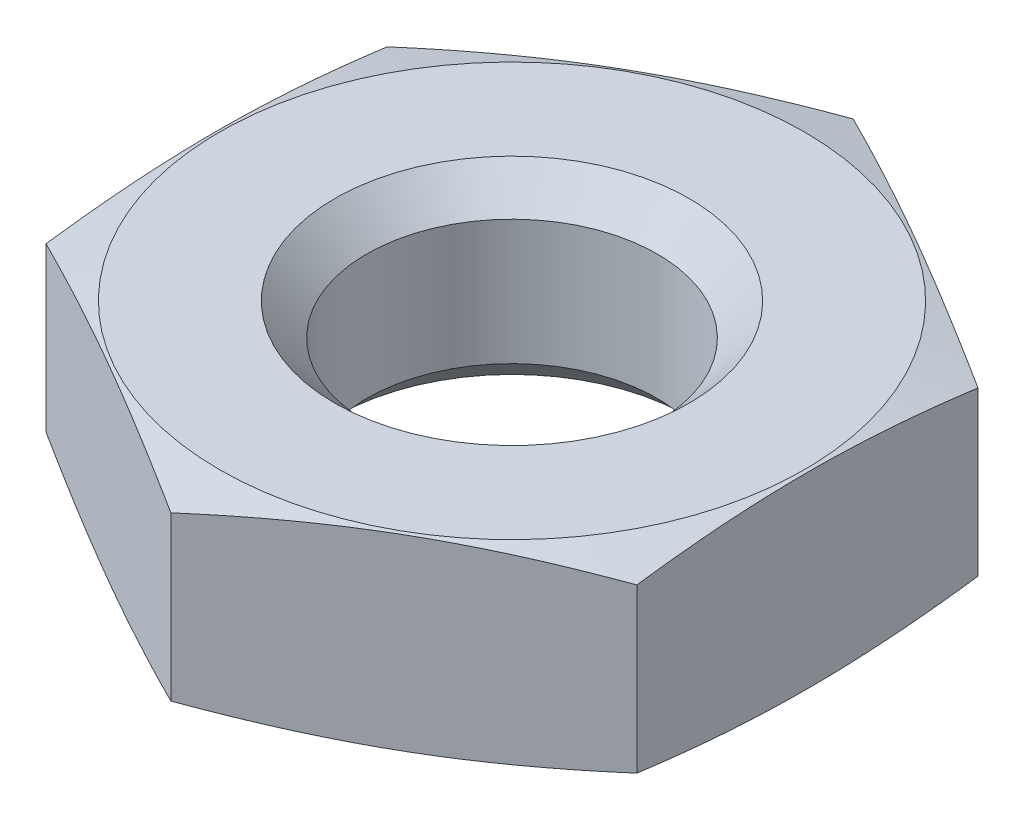
ISO-10303-21;
HEADER;
FILE_DESCRIPTION(('STEP AP214'),'2;1');
FILE_NAME('part.step','',(''),(''),'','','');
FILE_SCHEMA(('AUTOMOTIVE_DESIGN { 1 0 10303 214 1 1 1 1 }'));
ENDSEC;
DATA;
#1=APPLICATION_CONTEXT('core data for automotive mechanical design processes');
#2=APPLICATION_PROTOCOL_DEFINITION('international standard','automotive_design',2000,#1);
#3=PRODUCT_CONTEXT('',#1,'mechanical');
#4=PRODUCT('Part','Part','',(#3));
#5=PRODUCT_RELATED_PRODUCT_CATEGORY('part','',(#4));
#6=PRODUCT_DEFINITION_FORMATION('','',#4);
#7=PRODUCT_DEFINITION_CONTEXT('part definition',#1,'design');
#8=PRODUCT_DEFINITION('design','',#6,#7);
#9=PRODUCT_DEFINITION_SHAPE('','',#8);
#10=(LENGTH_UNIT() NAMED_UNIT(*) SI_UNIT(.MILLI.,.METRE.));
#11=(NAMED_UNIT(*) PLANE_ANGLE_UNIT() SI_UNIT($,.RADIAN.));
#12=(NAMED_UNIT(*) SI_UNIT($,.STERADIAN.) SOLID_ANGLE_UNIT());
#13=UNCERTAINTY_MEASURE_WITH_UNIT(LENGTH_MEASURE(1.E-05),#10,'distance_accuracy_value','');
#14=(GEOMETRIC_REPRESENTATION_CONTEXT(3) GLOBAL_UNCERTAINTY_ASSIGNED_CONTEXT((#13)) GLOBAL_UNIT_ASSIGNED_CONTEXT((#10,
#11,#12)) REPRESENTATION_CONTEXT('',''));
#15=CARTESIAN_POINT('',(0.,0.,0.));
#16=DIRECTION('',(0.,0.,1.));
#17=DIRECTION('',(1.,0.,0.));
#18=AXIS2_PLACEMENT_3D('',#15,#16,#17);
#19=CARTESIAN_POINT('',(0.,0.,0.));
#20=DIRECTION('',(0.,1.,0.));
#21=DIRECTION('',(0.,0.,1.));
#22=AXIS2_PLACEMENT_3D('',#19,#20,#21);
#23=PLANE('',#22);
#24=CARTESIAN_POINT('',(0.,0.,0.));
#25=DIRECTION('',(0.,-1.,0.));
#26=DIRECTION('',(0.,0.,-1.));
#27=AXIS2_PLACEMENT_3D('',#24,#25,#26);
#28=CIRCLE('',#27,4.95);
#29=CARTESIAN_POINT('',(0.,0.,-4.95));
#30=VERTEX_POINT('',#29);
#31=EDGE_CURVE('E117',#30,#30,#28,.T.);
#32=ORIENTED_EDGE('',*,*,#31,.F.);
#33=EDGE_LOOP('',(#32));
#34=FACE_BOUND('',#33,.T.);
#35=CARTESIAN_POINT('',(0.,0.,0.));
#36=DIRECTION('',(0.,1.,0.));
#37=DIRECTION('',(0.,0.,1.));
#38=AXIS2_PLACEMENT_3D('',#35,#36,#37);
#39=CIRCLE('',#38,3.);
#40=CARTESIAN_POINT('',(0.,0.,3.));
#41=VERTEX_POINT('',#40);
#42=EDGE_CURVE('E108',#41,#41,#39,.T.);
#43=ORIENTED_EDGE('',*,*,#42,.F.);
#44=EDGE_LOOP('',(#43));
#45=FACE_BOUND('',#44,.T.);
#46=ADVANCED_FACE('F39',(#34,#45),#23,.T.);
#47=CARTESIAN_POINT('',(4.95,-3.2,0.));
#48=DIRECTION('',(0.,-1.,0.));
#49=DIRECTION('',(0.,0.,-1.));
#50=AXIS2_PLACEMENT_3D('',#47,#48,#49);
#51=PLANE('',#50);
#52=CARTESIAN_POINT('',(0.,-3.2,0.));
#53=DIRECTION('',(0.,-1.,0.));
#54=DIRECTION('',(0.,0.,-1.));
#55=AXIS2_PLACEMENT_3D('',#52,#53,#54);
#56=CIRCLE('',#55,4.95);
#57=CARTESIAN_POINT('',(0.,-3.2,-4.95));
#58=VERTEX_POINT('',#57);
#59=EDGE_CURVE('E114',#58,#58,#56,.T.);
#60=ORIENTED_EDGE('',*,*,#59,.T.);
#61=EDGE_LOOP('',(#60));
#62=FACE_BOUND('',#61,.T.);
#63=CARTESIAN_POINT('',(0.,-3.2,0.));
#64=DIRECTION('',(0.,1.,0.));
#65=DIRECTION('',(0.,0.,1.));
#66=AXIS2_PLACEMENT_3D('',#63,#64,#65);
#67=CIRCLE('',#66,3.);
#68=CARTESIAN_POINT('',(0.,-3.2,3.));
#69=VERTEX_POINT('',#68);
#70=EDGE_CURVE('E351',#69,#69,#67,.T.);
#71=ORIENTED_EDGE('',*,*,#70,.T.);
#72=EDGE_LOOP('',(#71));
#73=FACE_BOUND('',#72,.T.);
#74=ADVANCED_FACE('F140',(#62,#73),#51,.T.);
#75=CARTESIAN_POINT('',(0.,-1.6,0.));
#76=DIRECTION('',(0.,-1.,0.));
#77=DIRECTION('',(0.,0.,-1.));
#78=AXIS2_PLACEMENT_3D('',#75,#76,#77);
#79=CONICAL_SURFACE('',#78,10.92128129211,1.30899693899574);
#80=ORIENTED_EDGE('',*,*,#31,.T.);
#81=EDGE_LOOP('',(#80));
#82=FACE_BOUND('',#81,.T.);
#83=CARTESIAN_POINT('',(0.000200000000000056,-0.220687822294338,-5.77361816195014));
#84=CARTESIAN_POINT('',(-0.207454004305664,-0.188549555804581,-5.65372906666596));
#85=CARTESIAN_POINT('',(-0.415484518325708,-0.159373272645011,-5.53362259339683));
#86=CARTESIAN_POINT('',(-0.832280248969818,-0.108113229801624,-5.29298546611236));
#87=CARTESIAN_POINT('',(-1.04104572932974,-0.0860323511907302,-5.17245465982905));
#88=CARTESIAN_POINT('',(-1.45804559853969,-0.0502522274677594,-4.93169967308864));
#89=CARTESIAN_POINT('',(-1.66627716741308,-0.0365103114883495,-4.81147712074581));
#90=CARTESIAN_POINT('',(-2.08300586365708,-0.0180838038255081,-4.57087869579028));
#91=CARTESIAN_POINT('',(-2.29150293182854,-0.0133974596215596,-4.45050285735624));
#92=CARTESIAN_POINT('',(-2.70849706817146,-0.013397459621558,-4.20975118048816));
#93=CARTESIAN_POINT('',(-2.91699413634291,-0.018083803825505,-4.08937534205412));
#94=CARTESIAN_POINT('',(-3.33372283258692,-0.0365103114883436,-3.84877691709859));
#95=CARTESIAN_POINT('',(-3.54195440146031,-0.0502522274677522,-3.72855436475576));
#96=CARTESIAN_POINT('',(-3.95895427067026,-0.0860323511907204,-3.48779937801535));
#97=CARTESIAN_POINT('',(-4.16771975103018,-0.108113229801612,-3.36726857173205));
#98=CARTESIAN_POINT('',(-4.58451548167429,-0.159373272644997,-3.12663144444758));
#99=CARTESIAN_POINT('',(-4.79254599569433,-0.188549555804566,-3.00652497117844));
#100=CARTESIAN_POINT('',(-5.0002,-0.220687822294322,-2.88663587589426));
#101=B_SPLINE_CURVE_WITH_KNOTS('',3,(#83,#84,#85,#86,#87,#88,#89,#90,#91,#92,#93,#94,#95,#96,
#97,#98,#99,#100),.UNSPECIFIED.,.F.,.F.,(4,2,2,2,2,2,2,2,4),(0.,0.725805237679813,
1.45190481561533,2.17425686883393,2.89646911159518,3.61868135435642,4.34103340757503,
5.06713298551055,5.79293822319036),.UNSPECIFIED.);
#102=CARTESIAN_POINT('',(0.,-0.220656881258476,-5.7735026918963));
#103=VERTEX_POINT('',#102);
#104=CARTESIAN_POINT('',(-5.,-0.220656881258461,-2.8867513459481));
#105=VERTEX_POINT('',#104);
#106=EDGE_CURVE('E113',#103,#105,#101,.T.);
#107=ORIENTED_EDGE('',*,*,#106,.T.);
#108=CARTESIAN_POINT('',(-5.,-1.14063800462012,-7.73093508057312));
#109=CARTESIAN_POINT('',(-5.,-1.08936240000554,-7.50297701689983));
#110=CARTESIAN_POINT('',(-5.,-1.03869834678135,-7.27487894610606));
#111=CARTESIAN_POINT('',(-5.,-0.938923659771285,-6.81833381184379));
#112=CARTESIAN_POINT('',(-5.,-0.88981309034785,-6.58988673432556));
#113=CARTESIAN_POINT('',(-5.,-0.793435996769751,-6.13238464648103));
#114=CARTESIAN_POINT('',(-5.,-0.746171197688716,-5.90332927148686));
#115=CARTESIAN_POINT('',(-5.,-0.653980649652257,-5.44474852289208));
#116=CARTESIAN_POINT('',(-5.,-0.609054881867156,-5.21522315309048));
#117=CARTESIAN_POINT('',(-5.,-0.522457178467669,-4.75749916393179));
#118=CARTESIAN_POINT('',(-5.,-0.480761654427966,-4.52930502882392));
#119=CARTESIAN_POINT('',(-5.,-0.400908035856761,-4.07229970348656));
#120=CARTESIAN_POINT('',(-5.,-0.362749865927748,-3.84348852651613));
#121=CARTESIAN_POINT('',(-5.,-0.290809760884917,-3.38519229582061));
#122=CARTESIAN_POINT('',(-5.,-0.257027472653694,-3.15570729800063));
#123=CARTESIAN_POINT('',(-5.,-0.194817345230125,-2.69600431838457));
#124=CARTESIAN_POINT('',(-5.,-0.166389515122861,-2.46578633534548));
#125=CARTESIAN_POINT('',(-5.,-0.115671295304904,-2.00197391292755));
#126=CARTESIAN_POINT('',(-5.,-0.0934555819147692,-1.76837118614386));
#127=CARTESIAN_POINT('',(-5.,-0.0566821520401409,-1.3005584399816));
#128=CARTESIAN_POINT('',(-5.,-0.0421242595760637,-1.06634843468283));
#129=CARTESIAN_POINT('',(-5.,-0.021514164560592,-0.597665832000252));
#130=CARTESIAN_POINT('',(-5.,-0.0154576510286622,-0.363193428091791));
#131=CARTESIAN_POINT('',(-5.,-0.0122246298335164,0.105813280844502));
#132=CARTESIAN_POINT('',(-5.,-0.0150480990826594,0.340347585709807));
#133=CARTESIAN_POINT('',(-5.,-0.0294192789403464,0.810061623076059));
#134=CARTESIAN_POINT('',(-5.,-0.0410010764365612,1.04524029111869));
#135=CARTESIAN_POINT('',(-5.,-0.0722219618928339,1.51505730934962));
#136=CARTESIAN_POINT('',(-5.,-0.0918612346522647,1.74969564702123));
#137=CARTESIAN_POINT('',(-5.,-0.138181917035147,2.21843069186745));
#138=CARTESIAN_POINT('',(-5.,-0.164868237309113,2.45252690607147));
#139=CARTESIAN_POINT('',(-5.,-0.224143591915323,2.9199616860284));
#140=CARTESIAN_POINT('',(-5.,-0.25673263546809,3.15330025059721));
#141=CARTESIAN_POINT('',(-5.,-0.327475954957309,3.62413082050116));
#142=CARTESIAN_POINT('',(-5.,-0.365732615812328,3.86160729789613));
#143=CARTESIAN_POINT('',(-5.,-0.446296738927151,4.33587587986845));
#144=CARTESIAN_POINT('',(-5.,-0.488604351737986,4.5726679586734));
#145=CARTESIAN_POINT('',(-5.,-0.576463930015246,5.04567613729648));
#146=CARTESIAN_POINT('',(-5.,-0.622016291427552,5.28189216317091));
#147=CARTESIAN_POINT('',(-5.,-0.715721397797306,5.75380925854518));
#148=CARTESIAN_POINT('',(-5.,-0.763874182630086,5.98951032009078));
#149=CARTESIAN_POINT('',(-5.,-0.911476013428582,6.69612400645412));
#150=CARTESIAN_POINT('',(-5.,-1.01403771661469,7.16638541494425));
#151=CARTESIAN_POINT('',(-5.,-1.22460159668864,8.10563618645675));
#152=CARTESIAN_POINT('',(-5.,-1.33260334617782,8.57462564636864));
#153=CARTESIAN_POINT('',(-5.,-1.55112057451624,9.50648852550758));
#154=CARTESIAN_POINT('',(-5.,-1.66159447228715,9.96937172128773));
#155=CARTESIAN_POINT('',(-5.,-1.88514022147479,10.8945201862102));
#156=CARTESIAN_POINT('',(-5.,-1.99821213541137,11.3567854401981));
#157=CARTESIAN_POINT('',(-5.,-2.22607496652026,12.2801616381083));
#158=CARTESIAN_POINT('',(-5.,-2.3408630760647,12.7412732761874));
#159=CARTESIAN_POINT('',(-5.,-2.57187470671301,13.6631184734053));
#160=CARTESIAN_POINT('',(-5.,-2.68809817311086,14.123852046244));
#161=CARTESIAN_POINT('',(-5.,-2.80481990525299,14.5844578389234));
#162=B_SPLINE_CURVE_WITH_KNOTS('',3,(#108,#109,#110,#111,#112,#113,#114,#115,#116,#117,#118,
#119,#120,#121,#122,#123,#124,#125,#126,#127,#128,#129,#130,#131,#132,#133,#134,#135,#136,#137,
#138,#139,#140,#141,#142,#143,#144,#145,#146,#147,#148,#149,#150,#151,#152,#153,#154,#155,#156,
#157,#158,#159,#160,#161),.UNSPECIFIED.,.F.,.F.,(4,2,2,2,2,2,2,2,2,2,2,2,2,2,2,2,2,2,2,2,2,2,2,
2,2,2,4),(0.,0.70096393152671,1.40195686677819,2.10358999826182,2.80521748058256,
3.50111173017783,4.19699114360917,4.89281436712552,5.58863877125716,6.29249959293576,
6.99634423892319,7.69983184188264,8.40331761580073,9.10955549600335,9.81580957478054,
10.5225571029144,11.2293057350535,11.9508770291112,12.6724751503193,13.3941614770934,
14.1158588734716,15.5597474703053,17.0035228040511,18.4311631202119,19.858837827816,
21.2843885766755,22.7098851599128),.UNSPECIFIED.);
#163=CARTESIAN_POINT('',(-5.,-0.220656881258461,2.8867513459481));
#164=VERTEX_POINT('',#163);
#165=EDGE_CURVE('E105',#105,#164,#162,.T.);
#166=ORIENTED_EDGE('',*,*,#165,.T.);
#167=CARTESIAN_POINT('',(-5.0002,-0.220687822294322,2.88663587589426));
#168=CARTESIAN_POINT('',(-4.79254599569434,-0.188549555804566,3.00652497117844));
#169=CARTESIAN_POINT('',(-4.58451548167429,-0.159373272644997,3.12663144444758));
#170=CARTESIAN_POINT('',(-4.16771975103018,-0.108113229801612,3.36726857173205));
#171=CARTESIAN_POINT('',(-3.95895427067026,-0.0860323511907203,3.48779937801535));
#172=CARTESIAN_POINT('',(-3.54195440146031,-0.0502522274677521,3.72855436475576));
#173=CARTESIAN_POINT('',(-3.33372283258692,-0.0365103114883434,3.84877691709859));
#174=CARTESIAN_POINT('',(-2.91699413634291,-0.018083803825505,4.08937534205412));
#175=CARTESIAN_POINT('',(-2.70849706817146,-0.0133974596215581,4.20975118048816));
#176=CARTESIAN_POINT('',(-2.29150293182854,-0.0133974596215597,4.45050285735624));
#177=CARTESIAN_POINT('',(-2.08300586365708,-0.0180838038255082,4.57087869579028));
#178=CARTESIAN_POINT('',(-1.66627716741308,-0.0365103114883494,4.81147712074581));
#179=CARTESIAN_POINT('',(-1.45804559853969,-0.0502522274677593,4.93169967308864));
#180=CARTESIAN_POINT('',(-1.04104572932974,-0.0860323511907301,5.17245465982905));
#181=CARTESIAN_POINT('',(-0.832280248969818,-0.108113229801623,5.29298546611236));
#182=CARTESIAN_POINT('',(-0.415484518325707,-0.159373272645011,5.53362259339683));
#183=CARTESIAN_POINT('',(-0.207454004305664,-0.188549555804581,5.65372906666596));
#184=CARTESIAN_POINT('',(0.000200000000000415,-0.220687822294338,5.77361816195014));
#185=B_SPLINE_CURVE_WITH_KNOTS('',3,(#167,#168,#169,#170,#171,#172,#173,#174,#175,#176,#177,
#178,#179,#180,#181,#182,#183,#184),.UNSPECIFIED.,.F.,.F.,(4,2,2,2,2,2,2,2,4),(0.,
0.725805237679813,1.45190481561533,2.17425686883394,2.89646911159518,3.61868135435643,
4.34103340757503,5.06713298551055,5.79293822319036),.UNSPECIFIED.);
#186=CARTESIAN_POINT('',(0.,-0.220656881258477,5.7735026918963));
#187=VERTEX_POINT('',#186);
#188=EDGE_CURVE('E94',#164,#187,#185,.T.);
#189=ORIENTED_EDGE('',*,*,#188,.T.);
#190=CARTESIAN_POINT('',(-0.000200000000000056,-0.220687822294338,5.77361816195014));
#191=CARTESIAN_POINT('',(0.207454004305664,-0.188549555804581,5.65372906666596));
#192=CARTESIAN_POINT('',(0.415484518325708,-0.159373272645011,5.53362259339683));
#193=CARTESIAN_POINT('',(0.832280248969818,-0.108113229801624,5.29298546611236));
#194=CARTESIAN_POINT('',(1.04104572932974,-0.0860323511907302,5.17245465982905));
#195=CARTESIAN_POINT('',(1.45804559853969,-0.0502522274677594,4.93169967308864));
#196=CARTESIAN_POINT('',(1.66627716741308,-0.0365103114883495,4.81147712074581));
#197=CARTESIAN_POINT('',(2.08300586365708,-0.0180838038255081,4.57087869579028));
#198=CARTESIAN_POINT('',(2.29150293182854,-0.0133974596215596,4.45050285735624));
#199=CARTESIAN_POINT('',(2.70849706817146,-0.013397459621558,4.20975118048816));
#200=CARTESIAN_POINT('',(2.91699413634291,-0.018083803825505,4.08937534205412));
#201=CARTESIAN_POINT('',(3.33372283258692,-0.0365103114883436,3.84877691709859));
#202=CARTESIAN_POINT('',(3.54195440146031,-0.0502522274677522,3.72855436475576));
#203=CARTESIAN_POINT('',(3.95895427067026,-0.0860323511907204,3.48779937801535));
#204=CARTESIAN_POINT('',(4.16771975103018,-0.108113229801612,3.36726857173205));
#205=CARTESIAN_POINT('',(4.58451548167429,-0.159373272644997,3.12663144444758));
#206=CARTESIAN_POINT('',(4.79254599569433,-0.188549555804566,3.00652497117844));
#207=CARTESIAN_POINT('',(5.0002,-0.220687822294322,2.88663587589426));
#208=B_SPLINE_CURVE_WITH_KNOTS('',3,(#190,#191,#192,#193,#194,#195,#196,#197,#198,#199,#200,
#201,#202,#203,#204,#205,#206,#207),.UNSPECIFIED.,.F.,.F.,(4,2,2,2,2,2,2,2,4),(0.,
0.725805237679813,1.45190481561533,2.17425686883393,2.89646911159518,3.61868135435642,
4.34103340757503,5.06713298551055,5.79293822319036),.UNSPECIFIED.);
#209=CARTESIAN_POINT('',(5.,-0.220656881258461,2.8867513459481));
#210=VERTEX_POINT('',#209);
#211=EDGE_CURVE('E99',#187,#210,#208,.T.);
#212=ORIENTED_EDGE('',*,*,#211,.T.);
#213=CARTESIAN_POINT('',(5.,-1.14063800462012,-7.73093508057312));
#214=CARTESIAN_POINT('',(5.,-1.08936240000554,-7.50297701689983));
#215=CARTESIAN_POINT('',(5.,-1.03869834678135,-7.27487894610606));
#216=CARTESIAN_POINT('',(5.,-0.938923659771285,-6.81833381184379));
#217=CARTESIAN_POINT('',(5.,-0.88981309034785,-6.58988673432556));
#218=CARTESIAN_POINT('',(5.,-0.793435996769751,-6.13238464648103));
#219=CARTESIAN_POINT('',(5.,-0.746171197688716,-5.90332927148686));
#220=CARTESIAN_POINT('',(5.,-0.653980649652257,-5.44474852289208));
#221=CARTESIAN_POINT('',(5.,-0.609054881867156,-5.21522315309048));
#222=CARTESIAN_POINT('',(5.,-0.522457178467669,-4.75749916393179));
#223=CARTESIAN_POINT('',(5.,-0.480761654427966,-4.52930502882392));
#224=CARTESIAN_POINT('',(5.,-0.400908035856761,-4.07229970348656));
#225=CARTESIAN_POINT('',(5.,-0.362749865927748,-3.84348852651613));
#226=CARTESIAN_POINT('',(5.,-0.290809760884917,-3.38519229582061));
#227=CARTESIAN_POINT('',(5.,-0.257027472653694,-3.15570729800063));
#228=CARTESIAN_POINT('',(5.,-0.194817345230125,-2.69600431838457));
#229=CARTESIAN_POINT('',(5.,-0.166389515122861,-2.46578633534548));
#230=CARTESIAN_POINT('',(5.,-0.115671295304904,-2.00197391292755));
#231=CARTESIAN_POINT('',(5.,-0.0934555819147692,-1.76837118614386));
#232=CARTESIAN_POINT('',(5.,-0.0566821520401409,-1.3005584399816));
#233=CARTESIAN_POINT('',(5.,-0.0421242595760637,-1.06634843468283));
#234=CARTESIAN_POINT('',(5.,-0.021514164560592,-0.597665832000252));
#235=CARTESIAN_POINT('',(5.,-0.0154576510286622,-0.363193428091791));
#236=CARTESIAN_POINT('',(5.,-0.0122246298335164,0.105813280844502));
#237=CARTESIAN_POINT('',(5.,-0.0150480990826594,0.340347585709807));
#238=CARTESIAN_POINT('',(5.,-0.0294192789403464,0.810061623076059));
#239=CARTESIAN_POINT('',(5.,-0.0410010764365612,1.04524029111869));
#240=CARTESIAN_POINT('',(5.,-0.0722219618928339,1.51505730934962));
#241=CARTESIAN_POINT('',(5.,-0.0918612346522647,1.74969564702123));
#242=CARTESIAN_POINT('',(5.,-0.138181917035147,2.21843069186745));
#243=CARTESIAN_POINT('',(5.,-0.164868237309113,2.45252690607147));
#244=CARTESIAN_POINT('',(5.,-0.224143591915323,2.9199616860284));
#245=CARTESIAN_POINT('',(5.,-0.25673263546809,3.15330025059721));
#246=CARTESIAN_POINT('',(5.,-0.327475954957309,3.62413082050116));
#247=CARTESIAN_POINT('',(5.,-0.365732615812328,3.86160729789613));
#248=CARTESIAN_POINT('',(5.,-0.446296738927151,4.33587587986845));
#249=CARTESIAN_POINT('',(5.,-0.488604351737986,4.5726679586734));
#250=CARTESIAN_POINT('',(5.,-0.576463930015246,5.04567613729648));
#251=CARTESIAN_POINT('',(5.,-0.622016291427552,5.28189216317091));
#252=CARTESIAN_POINT('',(5.,-0.715721397797306,5.75380925854518));
#253=CARTESIAN_POINT('',(5.,-0.763874182630086,5.98951032009078));
#254=CARTESIAN_POINT('',(5.,-0.911476013428582,6.69612400645412));
#255=CARTESIAN_POINT('',(5.,-1.01403771661469,7.16638541494425));
#256=CARTESIAN_POINT('',(5.,-1.22460159668864,8.10563618645675));
#257=CARTESIAN_POINT('',(5.,-1.33260334617782,8.57462564636864));
#258=CARTESIAN_POINT('',(5.,-1.55112057451624,9.50648852550758));
#259=CARTESIAN_POINT('',(5.,-1.66159447228715,9.96937172128773));
#260=CARTESIAN_POINT('',(5.,-1.88514022147479,10.8945201862102));
#261=CARTESIAN_POINT('',(5.,-1.99821213541137,11.3567854401981));
#262=CARTESIAN_POINT('',(5.,-2.22607496652026,12.2801616381083));
#263=CARTESIAN_POINT('',(5.,-2.3408630760647,12.7412732761874));
#264=CARTESIAN_POINT('',(5.,-2.57187470671301,13.6631184734053));
#265=CARTESIAN_POINT('',(5.,-2.68809817311086,14.123852046244));
#266=CARTESIAN_POINT('',(5.,-2.80481990525299,14.5844578389234));
#267=B_SPLINE_CURVE_WITH_KNOTS('',3,(#213,#214,#215,#216,#217,#218,#219,#220,#221,#222,#223,
#224,#225,#226,#227,#228,#229,#230,#231,#232,#233,#234,#235,#236,#237,#238,#239,#240,#241,#242,
#243,#244,#245,#246,#247,#248,#249,#250,#251,#252,#253,#254,#255,#256,#257,#258,#259,#260,#261,
#262,#263,#264,#265,#266),.UNSPECIFIED.,.F.,.F.,(4,2,2,2,2,2,2,2,2,2,2,2,2,2,2,2,2,2,2,2,2,2,2,
2,2,2,4),(0.,0.70096393152671,1.40195686677819,2.10358999826182,2.80521748058256,
3.50111173017783,4.19699114360917,4.89281436712552,5.58863877125716,6.29249959293576,
6.99634423892319,7.69983184188264,8.40331761580073,9.10955549600335,9.81580957478054,
10.5225571029144,11.2293057350535,11.9508770291112,12.6724751503193,13.3941614770934,
14.1158588734716,15.5597474703053,17.0035228040511,18.4311631202119,19.858837827816,
21.2843885766755,22.7098851599128),.UNSPECIFIED.);
#268=CARTESIAN_POINT('',(5.,-0.220656881258461,-2.8867513459481));
#269=VERTEX_POINT('',#268);
#270=EDGE_CURVE('E203',#210,#269,#267,.F.);
#271=ORIENTED_EDGE('',*,*,#270,.T.);
#272=CARTESIAN_POINT('',(5.0002,-0.220687822294322,-2.88663587589426));
#273=CARTESIAN_POINT('',(4.79254599569434,-0.188549555804566,-3.00652497117844));
#274=CARTESIAN_POINT('',(4.58451548167429,-0.159373272644997,-3.12663144444758));
#275=CARTESIAN_POINT('',(4.16771975103018,-0.108113229801612,-3.36726857173205));
#276=CARTESIAN_POINT('',(3.95895427067026,-0.0860323511907203,-3.48779937801535));
#277=CARTESIAN_POINT('',(3.54195440146031,-0.0502522274677521,-3.72855436475576));
#278=CARTESIAN_POINT('',(3.33372283258692,-0.0365103114883434,-3.84877691709859));
#279=CARTESIAN_POINT('',(2.91699413634291,-0.018083803825505,-4.08937534205412));
#280=CARTESIAN_POINT('',(2.70849706817146,-0.0133974596215581,-4.20975118048816));
#281=CARTESIAN_POINT('',(2.29150293182854,-0.0133974596215597,-4.45050285735624));
#282=CARTESIAN_POINT('',(2.08300586365708,-0.0180838038255082,-4.57087869579028));
#283=CARTESIAN_POINT('',(1.66627716741308,-0.0365103114883494,-4.81147712074581));
#284=CARTESIAN_POINT('',(1.45804559853969,-0.0502522274677593,-4.93169967308864));
#285=CARTESIAN_POINT('',(1.04104572932974,-0.0860323511907301,-5.17245465982905));
#286=CARTESIAN_POINT('',(0.832280248969818,-0.108113229801623,-5.29298546611236));
#287=CARTESIAN_POINT('',(0.415484518325707,-0.159373272645011,-5.53362259339683));
#288=CARTESIAN_POINT('',(0.207454004305664,-0.188549555804581,-5.65372906666596));
#289=CARTESIAN_POINT('',(-0.000200000000000415,-0.220687822294338,-5.77361816195014));
#290=B_SPLINE_CURVE_WITH_KNOTS('',3,(#272,#273,#274,#275,#276,#277,#278,#279,#280,#281,#282,
#283,#284,#285,#286,#287,#288,#289),.UNSPECIFIED.,.F.,.F.,(4,2,2,2,2,2,2,2,4),(0.,
0.725805237679813,1.45190481561533,2.17425686883394,2.89646911159518,3.61868135435643,
4.34103340757503,5.06713298551055,5.79293822319036),.UNSPECIFIED.);
#291=EDGE_CURVE('E119',#269,#103,#290,.T.);
#292=ORIENTED_EDGE('',*,*,#291,.T.);
#293=EDGE_LOOP('',(#107,#166,#189,#212,#271,#292));
#294=FACE_BOUND('',#293,.T.);
#295=ADVANCED_FACE('F111',(#82,#294),#79,.T.);
#296=CARTESIAN_POINT('',(-5.,-4.2,-2.8867513459481));
#297=DIRECTION('',(-1.,0.,0.));
#298=DIRECTION('',(0.,0.,1.));
#299=AXIS2_PLACEMENT_3D('',#296,#297,#298);
#300=PLANE('',#299);
#301=DIRECTION('',(0.,1.,0.));
#302=VECTOR('',#301,1.);
#303=CARTESIAN_POINT('',(-5.,-4.2,-2.8867513459481));
#304=LINE('',#303,#302);
#305=CARTESIAN_POINT('',(-5.,-2.97934311874154,-2.8867513459481));
#306=VERTEX_POINT('',#305);
#307=EDGE_CURVE('E100',#306,#105,#304,.T.);
#308=ORIENTED_EDGE('',*,*,#307,.F.);
#309=CARTESIAN_POINT('',(-5.,-2.05936199537988,-7.73093508057312));
#310=CARTESIAN_POINT('',(-5.,-2.11063759999446,-7.50297701689983));
#311=CARTESIAN_POINT('',(-5.,-2.16130165321865,-7.27487894610606));
#312=CARTESIAN_POINT('',(-5.,-2.26107634022872,-6.81833381184379));
#313=CARTESIAN_POINT('',(-5.,-2.31018690965215,-6.58988673432556));
#314=CARTESIAN_POINT('',(-5.,-2.40656400323025,-6.13238464648103));
#315=CARTESIAN_POINT('',(-5.,-2.45382880231129,-5.90332927148686));
#316=CARTESIAN_POINT('',(-5.,-2.54601935034774,-5.44474852289208));
#317=CARTESIAN_POINT('',(-5.,-2.59094511813284,-5.21522315309048));
#318=CARTESIAN_POINT('',(-5.,-2.67754282153233,-4.75749916393179));
#319=CARTESIAN_POINT('',(-5.,-2.71923834557203,-4.52930502882392));
#320=CARTESIAN_POINT('',(-5.,-2.79909196414324,-4.07229970348656));
#321=CARTESIAN_POINT('',(-5.,-2.83725013407225,-3.84348852651613));
#322=CARTESIAN_POINT('',(-5.,-2.90919023911508,-3.38519229582061));
#323=CARTESIAN_POINT('',(-5.,-2.94297252734631,-3.15570729800063));
#324=CARTESIAN_POINT('',(-5.,-3.00518265476988,-2.69600431838457));
#325=CARTESIAN_POINT('',(-5.,-3.03361048487714,-2.46578633534548));
#326=CARTESIAN_POINT('',(-5.,-3.0843287046951,-2.00197391292755));
#327=CARTESIAN_POINT('',(-5.,-3.10654441808523,-1.76837118614386));
#328=CARTESIAN_POINT('',(-5.,-3.14331784795986,-1.3005584399816));
#329=CARTESIAN_POINT('',(-5.,-3.15787574042394,-1.06634843468283));
#330=CARTESIAN_POINT('',(-5.,-3.17848583543941,-0.597665832000251));
#331=CARTESIAN_POINT('',(-5.,-3.18454234897134,-0.36319342809179));
#332=CARTESIAN_POINT('',(-5.,-3.18777537016648,0.105813280844502));
#333=CARTESIAN_POINT('',(-5.,-3.18495190091734,0.340347585709807));
#334=CARTESIAN_POINT('',(-5.,-3.17058072105965,0.810061623076059));
#335=CARTESIAN_POINT('',(-5.,-3.15899892356344,1.04524029111869));
#336=CARTESIAN_POINT('',(-5.,-3.12777803810717,1.51505730934962));
#337=CARTESIAN_POINT('',(-5.,-3.10813876534774,1.74969564702123));
#338=CARTESIAN_POINT('',(-5.,-3.06181808296485,2.21843069186745));
#339=CARTESIAN_POINT('',(-5.,-3.03513176269089,2.45252690607147));
#340=CARTESIAN_POINT('',(-5.,-2.97585640808468,2.9199616860284));
#341=CARTESIAN_POINT('',(-5.,-2.94326736453191,3.15330025059721));
#342=CARTESIAN_POINT('',(-5.,-2.87252404504269,3.62413082050116));
#343=CARTESIAN_POINT('',(-5.,-2.83426738418767,3.86160729789613));
#344=CARTESIAN_POINT('',(-5.,-2.75370326107285,4.33587587986845));
#345=CARTESIAN_POINT('',(-5.,-2.71139564826201,4.57266795867341));
#346=CARTESIAN_POINT('',(-5.,-2.62353606998475,5.04567613729648));
#347=CARTESIAN_POINT('',(-5.,-2.57798370857245,5.28189216317091));
#348=CARTESIAN_POINT('',(-5.,-2.48427860220269,5.75380925854518));
#349=CARTESIAN_POINT('',(-5.,-2.43612581736991,5.98951032009078));
#350=CARTESIAN_POINT('',(-5.,-2.28852398657142,6.69612400645412));
#351=CARTESIAN_POINT('',(-5.,-2.18596228338531,7.16638541494425));
#352=CARTESIAN_POINT('',(-5.,-1.97539840331136,8.10563618645675));
#353=CARTESIAN_POINT('',(-5.,-1.86739665382219,8.57462564636864));
#354=CARTESIAN_POINT('',(-5.,-1.64887942548376,9.50648852550758));
#355=CARTESIAN_POINT('',(-5.,-1.53840552771285,9.96937172128773));
#356=CARTESIAN_POINT('',(-5.,-1.31485977852521,10.8945201862102));
#357=CARTESIAN_POINT('',(-5.,-1.20178786458863,11.3567854401981));
#358=CARTESIAN_POINT('',(-5.,-0.973925033479745,12.2801616381083));
#359=CARTESIAN_POINT('',(-5.,-0.859136923935303,12.7412732761874));
#360=CARTESIAN_POINT('',(-5.,-0.62812529328699,13.6631184734053));
#361=CARTESIAN_POINT('',(-5.,-0.511901826889137,14.123852046244));
#362=CARTESIAN_POINT('',(-5.,-0.395180094747009,14.5844578389234));
#363=B_SPLINE_CURVE_WITH_KNOTS('',3,(#309,#310,#311,#312,#313,#314,#315,#316,#317,#318,#319,
#320,#321,#322,#323,#324,#325,#326,#327,#328,#329,#330,#331,#332,#333,#334,#335,#336,#337,#338,
#339,#340,#341,#342,#343,#344,#345,#346,#347,#348,#349,#350,#351,#352,#353,#354,#355,#356,#357,
#358,#359,#360,#361,#362),.UNSPECIFIED.,.F.,.F.,(4,2,2,2,2,2,2,2,2,2,2,2,2,2,2,2,2,2,2,2,2,2,2,
2,2,2,4),(0.,0.70096393152671,1.40195686677819,2.10358999826182,2.80521748058256,
3.50111173017783,4.19699114360917,4.89281436712552,5.58863877125716,6.29249959293576,
6.99634423892319,7.69983184188264,8.40331761580073,9.10955549600335,9.81580957478054,
10.5225571029144,11.2293057350535,11.9508770291112,12.6724751503193,13.3941614770934,
14.1158588734716,15.5597474703053,17.0035228040511,18.4311631202119,19.858837827816,
21.2843885766755,22.7098851599128),.UNSPECIFIED.);
#364=CARTESIAN_POINT('',(-5.,-2.97934311874154,2.8867513459481));
#365=VERTEX_POINT('',#364);
#366=EDGE_CURVE('E11',#365,#306,#363,.F.);
#367=ORIENTED_EDGE('',*,*,#366,.F.);
#368=DIRECTION('',(0.,1.,0.));
#369=VECTOR('',#368,1.);
#370=CARTESIAN_POINT('',(-5.,-4.2,2.8867513459481));
#371=LINE('',#370,#369);
#372=EDGE_CURVE('E64',#365,#164,#371,.T.);
#373=ORIENTED_EDGE('',*,*,#372,.T.);
#374=ORIENTED_EDGE('',*,*,#165,.F.);
#375=EDGE_LOOP('',(#308,#367,#373,#374));
#376=FACE_BOUND('',#375,.T.);
#377=ADVANCED_FACE('F104',(#376),#300,.T.);
#378=CARTESIAN_POINT('',(0.,-4.2,-5.7735026918963));
#379=DIRECTION('',(-0.500000000000009,0.,-0.866025403784433));
#380=DIRECTION('',(-0.866025403784433,0.,0.500000000000009));
#381=AXIS2_PLACEMENT_3D('',#378,#379,#380);
#382=PLANE('',#381);
#383=DIRECTION('',(0.,1.,0.));
#384=VECTOR('',#383,1.);
#385=CARTESIAN_POINT('',(0.,-4.2,-5.7735026918963));
#386=LINE('',#385,#384);
#387=CARTESIAN_POINT('',(0.,-2.97934311874152,-5.7735026918963));
#388=VERTEX_POINT('',#387);
#389=EDGE_CURVE('E246',#388,#103,#386,.T.);
#390=ORIENTED_EDGE('',*,*,#389,.F.);
#391=CARTESIAN_POINT('',(-5.0002,-2.97931217770568,-2.88663587589426));
#392=CARTESIAN_POINT('',(-4.79254599569433,-3.01145044419543,-3.00652497117844));
#393=CARTESIAN_POINT('',(-4.58451548167429,-3.040626727355,-3.12663144444758));
#394=CARTESIAN_POINT('',(-4.16771975103018,-3.09188677019839,-3.36726857173205));
#395=CARTESIAN_POINT('',(-3.95895427067026,-3.11396764880928,-3.48779937801535));
#396=CARTESIAN_POINT('',(-3.54195440146031,-3.14974777253225,-3.72855436475576));
#397=CARTESIAN_POINT('',(-3.33372283258692,-3.16348968851166,-3.84877691709859));
#398=CARTESIAN_POINT('',(-2.91699413634291,-3.1819161961745,-4.08937534205412));
#399=CARTESIAN_POINT('',(-2.70849706817146,-3.18660254037844,-4.20975118048816));
#400=CARTESIAN_POINT('',(-2.29150293182854,-3.18660254037844,-4.45050285735624));
#401=CARTESIAN_POINT('',(-2.08300586365708,-3.18191619617449,-4.57087869579028));
#402=CARTESIAN_POINT('',(-1.66627716741308,-3.16348968851165,-4.81147712074581));
#403=CARTESIAN_POINT('',(-1.45804559853969,-3.14974777253224,-4.93169967308864));
#404=CARTESIAN_POINT('',(-1.04104572932974,-3.11396764880927,-5.17245465982905));
#405=CARTESIAN_POINT('',(-0.832280248969818,-3.09188677019838,-5.29298546611236));
#406=CARTESIAN_POINT('',(-0.415484518325708,-3.04062672735499,-5.53362259339683));
#407=CARTESIAN_POINT('',(-0.207454004305664,-3.01145044419542,-5.65372906666596));
#408=CARTESIAN_POINT('',(0.000200000000000204,-2.97931217770566,-5.77361816195014));
#409=B_SPLINE_CURVE_WITH_KNOTS('',3,(#391,#392,#393,#394,#395,#396,#397,#398,#399,#400,#401,
#402,#403,#404,#405,#406,#407,#408),.UNSPECIFIED.,.F.,.F.,(4,2,2,2,2,2,2,2,4),(0.,
0.725805237679813,1.45190481561533,2.17425686883394,2.89646911159518,3.61868135435642,
4.34103340757503,5.06713298551055,5.79293822319036),.UNSPECIFIED.);
#410=EDGE_CURVE('E52',#306,#388,#409,.T.);
#411=ORIENTED_EDGE('',*,*,#410,.F.);
#412=ORIENTED_EDGE('',*,*,#307,.T.);
#413=ORIENTED_EDGE('',*,*,#106,.F.);
#414=EDGE_LOOP('',(#390,#411,#412,#413));
#415=FACE_BOUND('',#414,.T.);
#416=ADVANCED_FACE('F137',(#415),#382,.T.);
#417=CARTESIAN_POINT('',(5.,-4.2,-2.8867513459481));
#418=DIRECTION('',(0.500000000000009,0.,-0.866025403784433));
#419=DIRECTION('',(-0.866025403784433,0.,-0.500000000000009));
#420=AXIS2_PLACEMENT_3D('',#417,#418,#419);
#421=PLANE('',#420);
#422=DIRECTION('',(0.,1.,0.));
#423=VECTOR('',#422,1.);
#424=CARTESIAN_POINT('',(5.,-4.2,-2.8867513459481));
#425=LINE('',#424,#423);
#426=CARTESIAN_POINT('',(5.,-2.97934311874154,-2.8867513459481));
#427=VERTEX_POINT('',#426);
#428=EDGE_CURVE('E249',#427,#269,#425,.T.);
#429=ORIENTED_EDGE('',*,*,#428,.F.);
#430=CARTESIAN_POINT('',(-0.0002,-2.97931217770566,-5.77361816195014));
#431=CARTESIAN_POINT('',(0.207454004305665,-3.01145044419542,-5.65372906666596));
#432=CARTESIAN_POINT('',(0.415484518325708,-3.04062672735499,-5.53362259339683));
#433=CARTESIAN_POINT('',(0.832280248969818,-3.09188677019838,-5.29298546611236));
#434=CARTESIAN_POINT('',(1.04104572932974,-3.11396764880927,-5.17245465982905));
#435=CARTESIAN_POINT('',(1.45804559853969,-3.14974777253224,-4.93169967308864));
#436=CARTESIAN_POINT('',(1.66627716741308,-3.16348968851165,-4.81147712074581));
#437=CARTESIAN_POINT('',(2.08300586365708,-3.18191619617449,-4.57087869579028));
#438=CARTESIAN_POINT('',(2.29150293182854,-3.18660254037844,-4.45050285735624));
#439=CARTESIAN_POINT('',(2.70849706817146,-3.18660254037844,-4.20975118048816));
#440=CARTESIAN_POINT('',(2.91699413634291,-3.1819161961745,-4.08937534205412));
#441=CARTESIAN_POINT('',(3.33372283258692,-3.16348968851166,-3.84877691709859));
#442=CARTESIAN_POINT('',(3.54195440146031,-3.14974777253225,-3.72855436475576));
#443=CARTESIAN_POINT('',(3.95895427067026,-3.11396764880928,-3.48779937801535));
#444=CARTESIAN_POINT('',(4.16771975103018,-3.09188677019839,-3.36726857173205));
#445=CARTESIAN_POINT('',(4.58451548167429,-3.040626727355,-3.12663144444758));
#446=CARTESIAN_POINT('',(4.79254599569433,-3.01145044419543,-3.00652497117844));
#447=CARTESIAN_POINT('',(5.0002,-2.97931217770568,-2.88663587589426));
#448=B_SPLINE_CURVE_WITH_KNOTS('',3,(#430,#431,#432,#433,#434,#435,#436,#437,#438,#439,#440,
#441,#442,#443,#444,#445,#446,#447),.UNSPECIFIED.,.F.,.F.,(4,2,2,2,2,2,2,2,4),(0.,
0.725805237679812,1.45190481561533,2.17425686883393,2.89646911159518,3.61868135435642,
4.34103340757503,5.06713298551055,5.79293822319036),.UNSPECIFIED.);
#449=EDGE_CURVE('E174',#388,#427,#448,.T.);
#450=ORIENTED_EDGE('',*,*,#449,.F.);
#451=ORIENTED_EDGE('',*,*,#389,.T.);
#452=ORIENTED_EDGE('',*,*,#291,.F.);
#453=EDGE_LOOP('',(#429,#450,#451,#452));
#454=FACE_BOUND('',#453,.T.);
#455=ADVANCED_FACE('F188',(#454),#421,.T.);
#456=CARTESIAN_POINT('',(5.,-4.2,2.8867513459481));
#457=DIRECTION('',(1.,0.,0.));
#458=DIRECTION('',(0.,0.,-1.));
#459=AXIS2_PLACEMENT_3D('',#456,#457,#458);
#460=PLANE('',#459);
#461=DIRECTION('',(0.,1.,0.));
#462=VECTOR('',#461,1.);
#463=CARTESIAN_POINT('',(5.,-4.2,2.8867513459481));
#464=LINE('',#463,#462);
#465=CARTESIAN_POINT('',(5.,-2.97934311874154,2.8867513459481));
#466=VERTEX_POINT('',#465);
#467=EDGE_CURVE('E252',#466,#210,#464,.T.);
#468=ORIENTED_EDGE('',*,*,#467,.F.);
#469=CARTESIAN_POINT('',(5.,-2.05936199537988,-7.73093508057312));
#470=CARTESIAN_POINT('',(5.,-2.11063759999446,-7.50297701689983));
#471=CARTESIAN_POINT('',(5.,-2.16130165321865,-7.27487894610606));
#472=CARTESIAN_POINT('',(5.,-2.26107634022872,-6.81833381184379));
#473=CARTESIAN_POINT('',(5.,-2.31018690965215,-6.58988673432556));
#474=CARTESIAN_POINT('',(5.,-2.40656400323025,-6.13238464648103));
#475=CARTESIAN_POINT('',(5.,-2.45382880231129,-5.90332927148686));
#476=CARTESIAN_POINT('',(5.,-2.54601935034774,-5.44474852289208));
#477=CARTESIAN_POINT('',(5.,-2.59094511813284,-5.21522315309048));
#478=CARTESIAN_POINT('',(5.,-2.67754282153233,-4.75749916393179));
#479=CARTESIAN_POINT('',(5.,-2.71923834557203,-4.52930502882392));
#480=CARTESIAN_POINT('',(5.,-2.79909196414324,-4.07229970348656));
#481=CARTESIAN_POINT('',(5.,-2.83725013407225,-3.84348852651613));
#482=CARTESIAN_POINT('',(5.,-2.90919023911508,-3.38519229582061));
#483=CARTESIAN_POINT('',(5.,-2.94297252734631,-3.15570729800063));
#484=CARTESIAN_POINT('',(5.,-3.00518265476988,-2.69600431838457));
#485=CARTESIAN_POINT('',(5.,-3.03361048487714,-2.46578633534548));
#486=CARTESIAN_POINT('',(5.,-3.0843287046951,-2.00197391292755));
#487=CARTESIAN_POINT('',(5.,-3.10654441808523,-1.76837118614386));
#488=CARTESIAN_POINT('',(5.,-3.14331784795986,-1.3005584399816));
#489=CARTESIAN_POINT('',(5.,-3.15787574042394,-1.06634843468283));
#490=CARTESIAN_POINT('',(5.,-3.17848583543941,-0.597665832000251));
#491=CARTESIAN_POINT('',(5.,-3.18454234897134,-0.36319342809179));
#492=CARTESIAN_POINT('',(5.,-3.18777537016648,0.105813280844502));
#493=CARTESIAN_POINT('',(5.,-3.18495190091734,0.340347585709807));
#494=CARTESIAN_POINT('',(5.,-3.17058072105965,0.810061623076059));
#495=CARTESIAN_POINT('',(5.,-3.15899892356344,1.04524029111869));
#496=CARTESIAN_POINT('',(5.,-3.12777803810717,1.51505730934962));
#497=CARTESIAN_POINT('',(5.,-3.10813876534774,1.74969564702123));
#498=CARTESIAN_POINT('',(5.,-3.06181808296485,2.21843069186745));
#499=CARTESIAN_POINT('',(5.,-3.03513176269089,2.45252690607147));
#500=CARTESIAN_POINT('',(5.,-2.97585640808468,2.9199616860284));
#501=CARTESIAN_POINT('',(5.,-2.94326736453191,3.15330025059721));
#502=CARTESIAN_POINT('',(5.,-2.87252404504269,3.62413082050116));
#503=CARTESIAN_POINT('',(5.,-2.83426738418767,3.86160729789613));
#504=CARTESIAN_POINT('',(5.,-2.75370326107285,4.33587587986845));
#505=CARTESIAN_POINT('',(5.,-2.71139564826201,4.57266795867341));
#506=CARTESIAN_POINT('',(5.,-2.62353606998475,5.04567613729648));
#507=CARTESIAN_POINT('',(5.,-2.57798370857245,5.28189216317091));
#508=CARTESIAN_POINT('',(5.,-2.48427860220269,5.75380925854518));
#509=CARTESIAN_POINT('',(5.,-2.43612581736991,5.98951032009078));
#510=CARTESIAN_POINT('',(5.,-2.28852398657142,6.69612400645412));
#511=CARTESIAN_POINT('',(5.,-2.18596228338531,7.16638541494425));
#512=CARTESIAN_POINT('',(5.,-1.97539840331136,8.10563618645675));
#513=CARTESIAN_POINT('',(5.,-1.86739665382219,8.57462564636864));
#514=CARTESIAN_POINT('',(5.,-1.64887942548376,9.50648852550758));
#515=CARTESIAN_POINT('',(5.,-1.53840552771285,9.96937172128773));
#516=CARTESIAN_POINT('',(5.,-1.31485977852521,10.8945201862102));
#517=CARTESIAN_POINT('',(5.,-1.20178786458863,11.3567854401981));
#518=CARTESIAN_POINT('',(5.,-0.973925033479745,12.2801616381083));
#519=CARTESIAN_POINT('',(5.,-0.859136923935303,12.7412732761874));
#520=CARTESIAN_POINT('',(5.,-0.62812529328699,13.6631184734053));
#521=CARTESIAN_POINT('',(5.,-0.511901826889137,14.123852046244));
#522=CARTESIAN_POINT('',(5.,-0.395180094747009,14.5844578389234));
#523=B_SPLINE_CURVE_WITH_KNOTS('',3,(#469,#470,#471,#472,#473,#474,#475,#476,#477,#478,#479,
#480,#481,#482,#483,#484,#485,#486,#487,#488,#489,#490,#491,#492,#493,#494,#495,#496,#497,#498,
#499,#500,#501,#502,#503,#504,#505,#506,#507,#508,#509,#510,#511,#512,#513,#514,#515,#516,#517,
#518,#519,#520,#521,#522),.UNSPECIFIED.,.F.,.F.,(4,2,2,2,2,2,2,2,2,2,2,2,2,2,2,2,2,2,2,2,2,2,2,
2,2,2,4),(0.,0.70096393152671,1.40195686677819,2.10358999826182,2.80521748058256,
3.50111173017783,4.19699114360917,4.89281436712552,5.58863877125716,6.29249959293576,
6.99634423892319,7.69983184188264,8.40331761580073,9.10955549600335,9.81580957478054,
10.5225571029144,11.2293057350535,11.9508770291112,12.6724751503193,13.3941614770934,
14.1158588734716,15.5597474703053,17.0035228040511,18.4311631202119,19.858837827816,
21.2843885766755,22.7098851599128),.UNSPECIFIED.);
#524=EDGE_CURVE('E167',#427,#466,#523,.T.);
#525=ORIENTED_EDGE('',*,*,#524,.F.);
#526=ORIENTED_EDGE('',*,*,#428,.T.);
#527=ORIENTED_EDGE('',*,*,#270,.F.);
#528=EDGE_LOOP('',(#468,#525,#526,#527));
#529=FACE_BOUND('',#528,.T.);
#530=ADVANCED_FACE('F194',(#529),#460,.T.);
#531=CARTESIAN_POINT('',(0.,-4.2,5.7735026918963));
#532=DIRECTION('',(0.500000000000009,0.,0.866025403784433));
#533=DIRECTION('',(0.866025403784433,0.,-0.500000000000009));
#534=AXIS2_PLACEMENT_3D('',#531,#532,#533);
#535=PLANE('',#534);
#536=DIRECTION('',(0.,1.,0.));
#537=VECTOR('',#536,1.);
#538=CARTESIAN_POINT('',(0.,-4.2,5.7735026918963));
#539=LINE('',#538,#537);
#540=CARTESIAN_POINT('',(0.,-2.97934311874152,5.7735026918963));
#541=VERTEX_POINT('',#540);
#542=EDGE_CURVE('E59',#541,#187,#539,.T.);
#543=ORIENTED_EDGE('',*,*,#542,.F.);
#544=CARTESIAN_POINT('',(5.0002,-2.97931217770568,2.88663587589426));
#545=CARTESIAN_POINT('',(4.79254599569433,-3.01145044419543,3.00652497117844));
#546=CARTESIAN_POINT('',(4.58451548167429,-3.040626727355,3.12663144444758));
#547=CARTESIAN_POINT('',(4.16771975103018,-3.09188677019839,3.36726857173205));
#548=CARTESIAN_POINT('',(3.95895427067026,-3.11396764880928,3.48779937801535));
#549=CARTESIAN_POINT('',(3.54195440146031,-3.14974777253225,3.72855436475576));
#550=CARTESIAN_POINT('',(3.33372283258692,-3.16348968851166,3.84877691709859));
#551=CARTESIAN_POINT('',(2.91699413634291,-3.1819161961745,4.08937534205412));
#552=CARTESIAN_POINT('',(2.70849706817146,-3.18660254037844,4.20975118048816));
#553=CARTESIAN_POINT('',(2.29150293182854,-3.18660254037844,4.45050285735624));
#554=CARTESIAN_POINT('',(2.08300586365708,-3.18191619617449,4.57087869579028));
#555=CARTESIAN_POINT('',(1.66627716741308,-3.16348968851165,4.81147712074581));
#556=CARTESIAN_POINT('',(1.45804559853969,-3.14974777253224,4.93169967308864));
#557=CARTESIAN_POINT('',(1.04104572932974,-3.11396764880927,5.17245465982905));
#558=CARTESIAN_POINT('',(0.832280248969818,-3.09188677019838,5.29298546611236));
#559=CARTESIAN_POINT('',(0.415484518325708,-3.04062672735499,5.53362259339683));
#560=CARTESIAN_POINT('',(0.207454004305664,-3.01145044419542,5.65372906666596));
#561=CARTESIAN_POINT('',(-0.000200000000000204,-2.97931217770566,5.77361816195014));
#562=B_SPLINE_CURVE_WITH_KNOTS('',3,(#544,#545,#546,#547,#548,#549,#550,#551,#552,#553,#554,
#555,#556,#557,#558,#559,#560,#561),.UNSPECIFIED.,.F.,.F.,(4,2,2,2,2,2,2,2,4),(0.,
0.725805237679813,1.45190481561533,2.17425686883394,2.89646911159518,3.61868135435642,
4.34103340757503,5.06713298551055,5.79293822319036),.UNSPECIFIED.);
#563=EDGE_CURVE('E160',#466,#541,#562,.T.);
#564=ORIENTED_EDGE('',*,*,#563,.F.);
#565=ORIENTED_EDGE('',*,*,#467,.T.);
#566=ORIENTED_EDGE('',*,*,#211,.F.);
#567=EDGE_LOOP('',(#543,#564,#565,#566));
#568=FACE_BOUND('',#567,.T.);
#569=ADVANCED_FACE('F218',(#568),#535,.T.);
#570=CARTESIAN_POINT('',(-5.,-4.2,2.8867513459481));
#571=DIRECTION('',(-0.500000000000009,0.,0.866025403784433));
#572=DIRECTION('',(0.866025403784433,0.,0.500000000000009));
#573=AXIS2_PLACEMENT_3D('',#570,#571,#572);
#574=PLANE('',#573);
#575=ORIENTED_EDGE('',*,*,#372,.F.);
#576=CARTESIAN_POINT('',(0.0002,-2.97931217770566,5.77361816195014));
#577=CARTESIAN_POINT('',(-0.207454004305665,-3.01145044419542,5.65372906666596));
#578=CARTESIAN_POINT('',(-0.415484518325708,-3.04062672735499,5.53362259339683));
#579=CARTESIAN_POINT('',(-0.832280248969818,-3.09188677019838,5.29298546611236));
#580=CARTESIAN_POINT('',(-1.04104572932974,-3.11396764880927,5.17245465982905));
#581=CARTESIAN_POINT('',(-1.45804559853969,-3.14974777253224,4.93169967308864));
#582=CARTESIAN_POINT('',(-1.66627716741308,-3.16348968851165,4.81147712074581));
#583=CARTESIAN_POINT('',(-2.08300586365708,-3.18191619617449,4.57087869579028));
#584=CARTESIAN_POINT('',(-2.29150293182854,-3.18660254037844,4.45050285735624));
#585=CARTESIAN_POINT('',(-2.70849706817146,-3.18660254037844,4.20975118048816));
#586=CARTESIAN_POINT('',(-2.91699413634291,-3.1819161961745,4.08937534205412));
#587=CARTESIAN_POINT('',(-3.33372283258692,-3.16348968851166,3.84877691709859));
#588=CARTESIAN_POINT('',(-3.54195440146031,-3.14974777253225,3.72855436475576));
#589=CARTESIAN_POINT('',(-3.95895427067026,-3.11396764880928,3.48779937801535));
#590=CARTESIAN_POINT('',(-4.16771975103018,-3.09188677019839,3.36726857173205));
#591=CARTESIAN_POINT('',(-4.58451548167429,-3.040626727355,3.12663144444758));
#592=CARTESIAN_POINT('',(-4.79254599569433,-3.01145044419543,3.00652497117844));
#593=CARTESIAN_POINT('',(-5.0002,-2.97931217770568,2.88663587589426));
#594=B_SPLINE_CURVE_WITH_KNOTS('',3,(#576,#577,#578,#579,#580,#581,#582,#583,#584,#585,#586,
#587,#588,#589,#590,#591,#592,#593),.UNSPECIFIED.,.F.,.F.,(4,2,2,2,2,2,2,2,4),(0.,
0.725805237679812,1.45190481561533,2.17425686883393,2.89646911159518,3.61868135435642,
4.34103340757503,5.06713298551055,5.79293822319036),.UNSPECIFIED.);
#595=EDGE_CURVE('E152',#541,#365,#594,.T.);
#596=ORIENTED_EDGE('',*,*,#595,.F.);
#597=ORIENTED_EDGE('',*,*,#542,.T.);
#598=ORIENTED_EDGE('',*,*,#188,.F.);
#599=EDGE_LOOP('',(#575,#596,#597,#598));
#600=FACE_BOUND('',#599,.T.);
#601=ADVANCED_FACE('F95',(#600),#574,.T.);
#602=CARTESIAN_POINT('',(0.,-3.2,0.));
#603=DIRECTION('',(0.,1.,0.));
#604=DIRECTION('',(0.,0.,1.));
#605=AXIS2_PLACEMENT_3D('',#602,#603,#604);
#606=CONICAL_SURFACE('',#605,4.95,1.30899693899574);
#607=ORIENTED_EDGE('',*,*,#59,.F.);
#608=EDGE_LOOP('',(#607));
#609=FACE_BOUND('',#608,.T.);
#610=ORIENTED_EDGE('',*,*,#595,.T.);
#611=ORIENTED_EDGE('',*,*,#366,.T.);
#612=ORIENTED_EDGE('',*,*,#410,.T.);
#613=ORIENTED_EDGE('',*,*,#449,.T.);
#614=ORIENTED_EDGE('',*,*,#524,.T.);
#615=ORIENTED_EDGE('',*,*,#563,.T.);
#616=EDGE_LOOP('',(#610,#611,#612,#613,#614,#615));
#617=FACE_BOUND('',#616,.T.);
#618=ADVANCED_FACE('F144',(#609,#617),#606,.T.);
#619=CARTESIAN_POINT('',(0.,-0.5415,0.));
#620=DIRECTION('',(0.,1.,0.));
#621=DIRECTION('',(0.,0.,1.));
#622=AXIS2_PLACEMENT_3D('',#619,#620,#621);
#623=CONICAL_SURFACE('',#622,2.4585,0.785398163397449);
#624=ORIENTED_EDGE('',*,*,#42,.T.);
#625=EDGE_LOOP('',(#624));
#626=FACE_BOUND('',#625,.T.);
#627=CARTESIAN_POINT('',(0.,-0.5415,0.));
#628=DIRECTION('',(0.,1.,0.));
#629=DIRECTION('',(0.,0.,1.));
#630=AXIS2_PLACEMENT_3D('',#627,#628,#629);
#631=CIRCLE('',#630,2.4585);
#632=CARTESIAN_POINT('',(0.,-0.5415,2.4585));
#633=VERTEX_POINT('',#632);
#634=EDGE_CURVE('E238',#633,#633,#631,.T.);
#635=ORIENTED_EDGE('',*,*,#634,.F.);
#636=EDGE_LOOP('',(#635));
#637=FACE_BOUND('',#636,.T.);
#638=ADVANCED_FACE('F147',(#626,#637),#623,.F.);
#639=CARTESIAN_POINT('',(0.,-3.2,0.));
#640=DIRECTION('',(0.,1.,0.));
#641=DIRECTION('',(0.,0.,1.));
#642=AXIS2_PLACEMENT_3D('',#639,#640,#641);
#643=CYLINDRICAL_SURFACE('',#642,2.4585);
#644=ORIENTED_EDGE('',*,*,#634,.T.);
#645=EDGE_LOOP('',(#644));
#646=FACE_BOUND('',#645,.T.);
#647=CARTESIAN_POINT('',(0.,-2.6585,0.));
#648=DIRECTION('',(0.,1.,0.));
#649=DIRECTION('',(0.,0.,1.));
#650=AXIS2_PLACEMENT_3D('',#647,#648,#649);
#651=CIRCLE('',#650,2.4585);
#652=CARTESIAN_POINT('',(0.,-2.6585,2.4585));
#653=VERTEX_POINT('',#652);
#654=EDGE_CURVE('E241',#653,#653,#651,.T.);
#655=ORIENTED_EDGE('',*,*,#654,.F.);
#656=EDGE_LOOP('',(#655));
#657=FACE_BOUND('',#656,.T.);
#658=ADVANCED_FACE('F301',(#646,#657),#643,.F.);
#659=CARTESIAN_POINT('',(0.,-3.2,0.));
#660=DIRECTION('',(0.,-1.,0.));
#661=DIRECTION('',(0.,0.,-1.));
#662=AXIS2_PLACEMENT_3D('',#659,#660,#661);
#663=CONICAL_SURFACE('',#662,3.,0.785398163397449);
#664=ORIENTED_EDGE('',*,*,#654,.T.);
#665=EDGE_LOOP('',(#664));
#666=FACE_BOUND('',#665,.T.);
#667=ORIENTED_EDGE('',*,*,#70,.F.);
#668=EDGE_LOOP('',(#667));
#669=FACE_BOUND('',#668,.T.);
#670=ADVANCED_FACE('F305',(#666,#669),#663,.F.);
#671=CLOSED_SHELL('',(#46,#74,#295,#377,#416,#455,#530,#569,#601,#618,#638,#658,#670));
#672=MANIFOLD_SOLID_BREP('B2',#671);
#673=ADVANCED_BREP_SHAPE_REPRESENTATION('',(#18,#672),#14);
#674=SHAPE_DEFINITION_REPRESENTATION(#9,#673);
ENDSEC;
END-ISO-10303-21;
